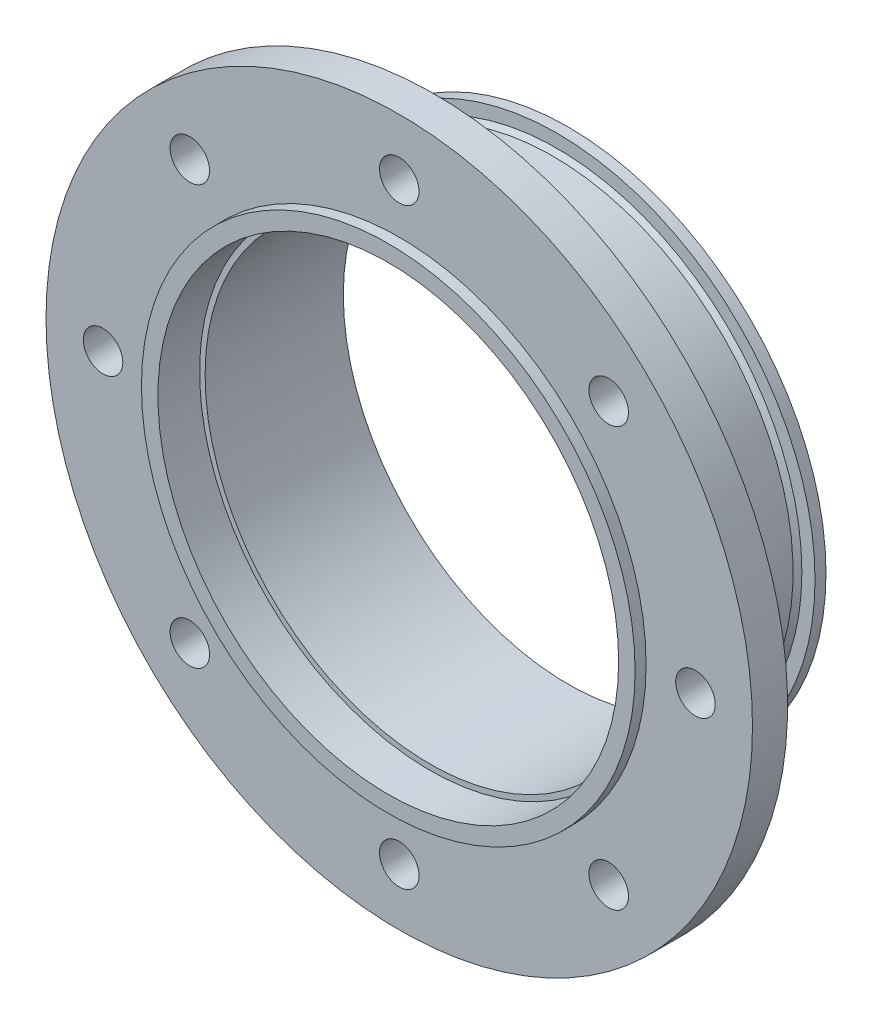
ISO-10303-21;
HEADER;
FILE_DESCRIPTION(('STEP AP214'),'2;1');
FILE_NAME('part.step','',(''),(''),'','','');
FILE_SCHEMA(('AUTOMOTIVE_DESIGN { 1 0 10303 214 1 1 1 1 }'));
ENDSEC;
DATA;
#1=APPLICATION_CONTEXT('core data for automotive mechanical design processes');
#2=APPLICATION_PROTOCOL_DEFINITION('international standard','automotive_design',2000,#1);
#3=PRODUCT_CONTEXT('',#1,'mechanical');
#4=PRODUCT('Part','Part','',(#3));
#5=PRODUCT_RELATED_PRODUCT_CATEGORY('part','',(#4));
#6=PRODUCT_DEFINITION_FORMATION('','',#4);
#7=PRODUCT_DEFINITION_CONTEXT('part definition',#1,'design');
#8=PRODUCT_DEFINITION('design','',#6,#7);
#9=PRODUCT_DEFINITION_SHAPE('','',#8);
#10=(LENGTH_UNIT() NAMED_UNIT(*) SI_UNIT(.MILLI.,.METRE.));
#11=(NAMED_UNIT(*) PLANE_ANGLE_UNIT() SI_UNIT($,.RADIAN.));
#12=(NAMED_UNIT(*) SI_UNIT($,.STERADIAN.) SOLID_ANGLE_UNIT());
#13=UNCERTAINTY_MEASURE_WITH_UNIT(LENGTH_MEASURE(1.E-05),#10,'distance_accuracy_value','');
#14=(GEOMETRIC_REPRESENTATION_CONTEXT(3) GLOBAL_UNCERTAINTY_ASSIGNED_CONTEXT((#13)) GLOBAL_UNIT_ASSIGNED_CONTEXT((#10,
#11,#12)) REPRESENTATION_CONTEXT('',''));
#15=CARTESIAN_POINT('',(0.,0.,0.));
#16=DIRECTION('',(0.,0.,1.));
#17=DIRECTION('',(1.,0.,0.));
#18=AXIS2_PLACEMENT_3D('',#15,#16,#17);
#19=CARTESIAN_POINT('',(0.,0.,82.));
#20=DIRECTION('',(0.,0.,-1.));
#21=DIRECTION('',(-1.,0.,0.));
#22=AXIS2_PLACEMENT_3D('',#19,#20,#21);
#23=CYLINDRICAL_SURFACE('',#22,102.5);
#24=CARTESIAN_POINT('',(0.,0.,0.));
#25=DIRECTION('',(0.,0.,1.));
#26=DIRECTION('',(1.,0.,0.));
#27=AXIS2_PLACEMENT_3D('',#24,#25,#26);
#28=CIRCLE('',#27,102.5);
#29=CARTESIAN_POINT('',(102.5,0.,0.));
#30=VERTEX_POINT('',#29);
#31=EDGE_CURVE('E74',#30,#30,#28,.T.);
#32=ORIENTED_EDGE('',*,*,#31,.F.);
#33=EDGE_LOOP('',(#32));
#34=FACE_BOUND('',#33,.T.);
#35=CARTESIAN_POINT('',(0.,0.,63.));
#36=DIRECTION('',(0.,0.,1.));
#37=DIRECTION('',(1.,0.,0.));
#38=AXIS2_PLACEMENT_3D('',#35,#36,#37);
#39=CIRCLE('',#38,102.5);
#40=CARTESIAN_POINT('',(102.5,0.,63.));
#41=VERTEX_POINT('',#40);
#42=EDGE_CURVE('E54',#41,#41,#39,.T.);
#43=ORIENTED_EDGE('',*,*,#42,.T.);
#44=EDGE_LOOP('',(#43));
#45=FACE_BOUND('',#44,.T.);
#46=ADVANCED_FACE('F49',(#34,#45),#23,.F.);
#47=CARTESIAN_POINT('',(0.,0.,82.));
#48=DIRECTION('',(0.,0.,-1.));
#49=DIRECTION('',(-1.,0.,0.));
#50=AXIS2_PLACEMENT_3D('',#47,#48,#49);
#51=CYLINDRICAL_SURFACE('',#50,161.);
#52=CARTESIAN_POINT('',(0.,0.,61.));
#53=DIRECTION('',(0.,0.,-1.));
#54=DIRECTION('',(-1.,0.,0.));
#55=AXIS2_PLACEMENT_3D('',#52,#53,#54);
#56=CIRCLE('',#55,161.);
#57=CARTESIAN_POINT('',(-161.,0.,61.));
#58=VERTEX_POINT('',#57);
#59=EDGE_CURVE('E86',#58,#58,#56,.T.);
#60=ORIENTED_EDGE('',*,*,#59,.F.);
#61=EDGE_LOOP('',(#60));
#62=FACE_BOUND('',#61,.T.);
#63=CARTESIAN_POINT('',(0.,0.,77.));
#64=DIRECTION('',(0.,0.,1.));
#65=DIRECTION('',(1.,0.,0.));
#66=AXIS2_PLACEMENT_3D('',#63,#64,#65);
#67=CIRCLE('',#66,161.);
#68=CARTESIAN_POINT('',(161.,0.,77.));
#69=VERTEX_POINT('',#68);
#70=EDGE_CURVE('E80',#69,#69,#67,.T.);
#71=ORIENTED_EDGE('',*,*,#70,.F.);
#72=EDGE_LOOP('',(#71));
#73=FACE_BOUND('',#72,.T.);
#74=ADVANCED_FACE('F190',(#62,#73),#51,.T.);
#75=CARTESIAN_POINT('',(0.,135.,0.));
#76=DIRECTION('',(0.,0.,1.));
#77=DIRECTION('',(1.,0.,0.));
#78=AXIS2_PLACEMENT_3D('',#75,#76,#77);
#79=CYLINDRICAL_SURFACE('',#78,9.);
#80=CARTESIAN_POINT('',(0.,135.,61.));
#81=DIRECTION('',(0.,0.,-1.));
#82=DIRECTION('',(-1.,0.,0.));
#83=AXIS2_PLACEMENT_3D('',#80,#81,#82);
#84=CIRCLE('',#83,9.);
#85=CARTESIAN_POINT('',(-9.,135.,61.));
#86=VERTEX_POINT('',#85);
#87=EDGE_CURVE('E90',#86,#86,#84,.F.);
#88=ORIENTED_EDGE('',*,*,#87,.F.);
#89=EDGE_LOOP('',(#88));
#90=FACE_BOUND('',#89,.T.);
#91=CARTESIAN_POINT('',(0.,135.,77.));
#92=DIRECTION('',(0.,0.,1.));
#93=DIRECTION('',(1.,0.,0.));
#94=AXIS2_PLACEMENT_3D('',#91,#92,#93);
#95=CIRCLE('',#94,9.);
#96=CARTESIAN_POINT('',(9.,135.,77.));
#97=VERTEX_POINT('',#96);
#98=EDGE_CURVE('E125',#97,#97,#95,.F.);
#99=ORIENTED_EDGE('',*,*,#98,.F.);
#100=EDGE_LOOP('',(#99));
#101=FACE_BOUND('',#100,.T.);
#102=ADVANCED_FACE('F196',(#90,#101),#79,.F.);
#103=CARTESIAN_POINT('',(-95.4594154601841,95.4594154601838,0.));
#104=DIRECTION('',(0.,0.,1.));
#105=DIRECTION('',(1.,0.,0.));
#106=AXIS2_PLACEMENT_3D('',#103,#104,#105);
#107=CYLINDRICAL_SURFACE('',#106,9.);
#108=CARTESIAN_POINT('',(-95.4594154601841,95.4594154601838,61.));
#109=DIRECTION('',(0.,0.,-1.));
#110=DIRECTION('',(-1.,0.,0.));
#111=AXIS2_PLACEMENT_3D('',#108,#109,#110);
#112=CIRCLE('',#111,9.);
#113=CARTESIAN_POINT('',(-104.459415460184,95.4594154601838,61.));
#114=VERTEX_POINT('',#113);
#115=EDGE_CURVE('E94',#114,#114,#112,.F.);
#116=ORIENTED_EDGE('',*,*,#115,.F.);
#117=EDGE_LOOP('',(#116));
#118=FACE_BOUND('',#117,.T.);
#119=CARTESIAN_POINT('',(-95.4594154601841,95.4594154601838,77.));
#120=DIRECTION('',(0.,0.,1.));
#121=DIRECTION('',(1.,0.,0.));
#122=AXIS2_PLACEMENT_3D('',#119,#120,#121);
#123=CIRCLE('',#122,9.);
#124=CARTESIAN_POINT('',(-86.4594154601841,95.4594154601838,77.));
#125=VERTEX_POINT('',#124);
#126=EDGE_CURVE('E132',#125,#125,#123,.F.);
#127=ORIENTED_EDGE('',*,*,#126,.F.);
#128=EDGE_LOOP('',(#127));
#129=FACE_BOUND('',#128,.T.);
#130=ADVANCED_FACE('F261',(#118,#129),#107,.F.);
#131=CARTESIAN_POINT('',(95.4594154601828,95.4594154601851,0.));
#132=DIRECTION('',(0.,0.,1.));
#133=DIRECTION('',(1.,0.,0.));
#134=AXIS2_PLACEMENT_3D('',#131,#132,#133);
#135=CYLINDRICAL_SURFACE('',#134,9.);
#136=CARTESIAN_POINT('',(95.4594154601828,95.4594154601851,61.));
#137=DIRECTION('',(0.,0.,-1.));
#138=DIRECTION('',(-1.,0.,0.));
#139=AXIS2_PLACEMENT_3D('',#136,#137,#138);
#140=CIRCLE('',#139,9.);
#141=CARTESIAN_POINT('',(86.4594154601828,95.4594154601851,61.));
#142=VERTEX_POINT('',#141);
#143=EDGE_CURVE('E98',#142,#142,#140,.F.);
#144=ORIENTED_EDGE('',*,*,#143,.F.);
#145=EDGE_LOOP('',(#144));
#146=FACE_BOUND('',#145,.T.);
#147=CARTESIAN_POINT('',(95.4594154601828,95.4594154601851,77.));
#148=DIRECTION('',(0.,0.,1.));
#149=DIRECTION('',(1.,0.,0.));
#150=AXIS2_PLACEMENT_3D('',#147,#148,#149);
#151=CIRCLE('',#150,9.);
#152=CARTESIAN_POINT('',(104.459415460183,95.4594154601851,77.));
#153=VERTEX_POINT('',#152);
#154=EDGE_CURVE('E136',#153,#153,#151,.F.);
#155=ORIENTED_EDGE('',*,*,#154,.F.);
#156=EDGE_LOOP('',(#155));
#157=FACE_BOUND('',#156,.T.);
#158=ADVANCED_FACE('F257',(#146,#157),#135,.F.);
#159=CARTESIAN_POINT('',(135.,1.41404994223147E-12,0.));
#160=DIRECTION('',(0.,0.,1.));
#161=DIRECTION('',(1.,0.,0.));
#162=AXIS2_PLACEMENT_3D('',#159,#160,#161);
#163=CYLINDRICAL_SURFACE('',#162,9.);
#164=CARTESIAN_POINT('',(135.,1.41404994223147E-12,61.));
#165=DIRECTION('',(0.,0.,-1.));
#166=DIRECTION('',(-1.,0.,0.));
#167=AXIS2_PLACEMENT_3D('',#164,#165,#166);
#168=CIRCLE('',#167,9.);
#169=CARTESIAN_POINT('',(126.,1.41404994223147E-12,61.));
#170=VERTEX_POINT('',#169);
#171=EDGE_CURVE('E102',#170,#170,#168,.F.);
#172=ORIENTED_EDGE('',*,*,#171,.F.);
#173=EDGE_LOOP('',(#172));
#174=FACE_BOUND('',#173,.T.);
#175=CARTESIAN_POINT('',(135.,1.41404994223147E-12,77.));
#176=DIRECTION('',(0.,0.,1.));
#177=DIRECTION('',(1.,0.,0.));
#178=AXIS2_PLACEMENT_3D('',#175,#176,#177);
#179=CIRCLE('',#178,9.);
#180=CARTESIAN_POINT('',(144.,1.41404994223147E-12,77.));
#181=VERTEX_POINT('',#180);
#182=EDGE_CURVE('E140',#181,#181,#179,.F.);
#183=ORIENTED_EDGE('',*,*,#182,.F.);
#184=EDGE_LOOP('',(#183));
#185=FACE_BOUND('',#184,.T.);
#186=ADVANCED_FACE('F253',(#174,#185),#163,.F.);
#187=CARTESIAN_POINT('',(95.4594154601848,-95.4594154601831,0.));
#188=DIRECTION('',(0.,0.,1.));
#189=DIRECTION('',(1.,0.,0.));
#190=AXIS2_PLACEMENT_3D('',#187,#188,#189);
#191=CYLINDRICAL_SURFACE('',#190,9.);
#192=CARTESIAN_POINT('',(95.4594154601848,-95.4594154601831,61.));
#193=DIRECTION('',(0.,0.,-1.));
#194=DIRECTION('',(-1.,0.,0.));
#195=AXIS2_PLACEMENT_3D('',#192,#193,#194);
#196=CIRCLE('',#195,9.);
#197=CARTESIAN_POINT('',(86.4594154601847,-95.4594154601831,61.));
#198=VERTEX_POINT('',#197);
#199=EDGE_CURVE('E106',#198,#198,#196,.F.);
#200=ORIENTED_EDGE('',*,*,#199,.F.);
#201=EDGE_LOOP('',(#200));
#202=FACE_BOUND('',#201,.T.);
#203=CARTESIAN_POINT('',(95.4594154601848,-95.4594154601831,77.));
#204=DIRECTION('',(0.,0.,1.));
#205=DIRECTION('',(1.,0.,0.));
#206=AXIS2_PLACEMENT_3D('',#203,#204,#205);
#207=CIRCLE('',#206,9.);
#208=CARTESIAN_POINT('',(104.459415460185,-95.4594154601831,77.));
#209=VERTEX_POINT('',#208);
#210=EDGE_CURVE('E144',#209,#209,#207,.F.);
#211=ORIENTED_EDGE('',*,*,#210,.F.);
#212=EDGE_LOOP('',(#211));
#213=FACE_BOUND('',#212,.T.);
#214=ADVANCED_FACE('F256',(#202,#213),#191,.F.);
#215=CARTESIAN_POINT('',(0.,-135.,0.));
#216=DIRECTION('',(0.,0.,1.));
#217=DIRECTION('',(1.,0.,0.));
#218=AXIS2_PLACEMENT_3D('',#215,#216,#217);
#219=CYLINDRICAL_SURFACE('',#218,9.);
#220=CARTESIAN_POINT('',(0.,-135.,61.));
#221=DIRECTION('',(0.,0.,-1.));
#222=DIRECTION('',(-1.,0.,0.));
#223=AXIS2_PLACEMENT_3D('',#220,#221,#222);
#224=CIRCLE('',#223,9.);
#225=CARTESIAN_POINT('',(-9.,-135.,61.));
#226=VERTEX_POINT('',#225);
#227=EDGE_CURVE('E110',#226,#226,#224,.F.);
#228=ORIENTED_EDGE('',*,*,#227,.F.);
#229=EDGE_LOOP('',(#228));
#230=FACE_BOUND('',#229,.T.);
#231=CARTESIAN_POINT('',(0.,-135.,77.));
#232=DIRECTION('',(0.,0.,1.));
#233=DIRECTION('',(1.,0.,0.));
#234=AXIS2_PLACEMENT_3D('',#231,#232,#233);
#235=CIRCLE('',#234,9.);
#236=CARTESIAN_POINT('',(9.,-135.,77.));
#237=VERTEX_POINT('',#236);
#238=EDGE_CURVE('E148',#237,#237,#235,.F.);
#239=ORIENTED_EDGE('',*,*,#238,.F.);
#240=EDGE_LOOP('',(#239));
#241=FACE_BOUND('',#240,.T.);
#242=ADVANCED_FACE('F269',(#230,#241),#219,.F.);
#243=CARTESIAN_POINT('',(-95.4594154601834,-95.4594154601844,0.));
#244=DIRECTION('',(0.,0.,1.));
#245=DIRECTION('',(1.,0.,0.));
#246=AXIS2_PLACEMENT_3D('',#243,#244,#245);
#247=CYLINDRICAL_SURFACE('',#246,9.);
#248=CARTESIAN_POINT('',(-95.4594154601834,-95.4594154601844,61.));
#249=DIRECTION('',(0.,0.,-1.));
#250=DIRECTION('',(-1.,0.,0.));
#251=AXIS2_PLACEMENT_3D('',#248,#249,#250);
#252=CIRCLE('',#251,9.);
#253=CARTESIAN_POINT('',(-104.459415460183,-95.4594154601844,61.));
#254=VERTEX_POINT('',#253);
#255=EDGE_CURVE('E85',#254,#254,#252,.F.);
#256=ORIENTED_EDGE('',*,*,#255,.F.);
#257=EDGE_LOOP('',(#256));
#258=FACE_BOUND('',#257,.T.);
#259=CARTESIAN_POINT('',(-95.4594154601834,-95.4594154601844,77.));
#260=DIRECTION('',(0.,0.,1.));
#261=DIRECTION('',(1.,0.,0.));
#262=AXIS2_PLACEMENT_3D('',#259,#260,#261);
#263=CIRCLE('',#262,9.);
#264=CARTESIAN_POINT('',(-86.4594154601834,-95.4594154601844,77.));
#265=VERTEX_POINT('',#264);
#266=EDGE_CURVE('E79',#265,#265,#263,.F.);
#267=ORIENTED_EDGE('',*,*,#266,.F.);
#268=EDGE_LOOP('',(#267));
#269=FACE_BOUND('',#268,.T.);
#270=ADVANCED_FACE('F265',(#258,#269),#247,.F.);
#271=CARTESIAN_POINT('',(-135.,-4.71349980743823E-13,0.));
#272=DIRECTION('',(0.,0.,1.));
#273=DIRECTION('',(1.,0.,0.));
#274=AXIS2_PLACEMENT_3D('',#271,#272,#273);
#275=CYLINDRICAL_SURFACE('',#274,9.);
#276=CARTESIAN_POINT('',(-135.,-4.71349980743823E-13,61.));
#277=DIRECTION('',(0.,0.,-1.));
#278=DIRECTION('',(-1.,0.,0.));
#279=AXIS2_PLACEMENT_3D('',#276,#277,#278);
#280=CIRCLE('',#279,9.);
#281=CARTESIAN_POINT('',(-144.,-4.71349980743823E-13,61.));
#282=VERTEX_POINT('',#281);
#283=EDGE_CURVE('E81',#282,#282,#280,.F.);
#284=ORIENTED_EDGE('',*,*,#283,.F.);
#285=EDGE_LOOP('',(#284));
#286=FACE_BOUND('',#285,.T.);
#287=CARTESIAN_POINT('',(-135.,-4.71349980743823E-13,77.));
#288=DIRECTION('',(0.,0.,1.));
#289=DIRECTION('',(1.,0.,0.));
#290=AXIS2_PLACEMENT_3D('',#287,#288,#289);
#291=CIRCLE('',#290,9.);
#292=CARTESIAN_POINT('',(-126.,-4.71349980743823E-13,77.));
#293=VERTEX_POINT('',#292);
#294=EDGE_CURVE('E75',#293,#293,#291,.F.);
#295=ORIENTED_EDGE('',*,*,#294,.F.);
#296=EDGE_LOOP('',(#295));
#297=FACE_BOUND('',#296,.T.);
#298=ADVANCED_FACE('F207',(#286,#297),#275,.F.);
#299=CARTESIAN_POINT('',(0.,0.,82.));
#300=DIRECTION('',(0.,0.,1.));
#301=DIRECTION('',(1.,0.,0.));
#302=AXIS2_PLACEMENT_3D('',#299,#300,#301);
#303=PLANE('',#302);
#304=CARTESIAN_POINT('',(0.,0.,82.));
#305=DIRECTION('',(0.,0.,1.));
#306=DIRECTION('',(1.,0.,0.));
#307=AXIS2_PLACEMENT_3D('',#304,#305,#306);
#308=CIRCLE('',#307,105.);
#309=CARTESIAN_POINT('',(105.,0.,82.));
#310=VERTEX_POINT('',#309);
#311=EDGE_CURVE('E166',#310,#310,#308,.T.);
#312=ORIENTED_EDGE('',*,*,#311,.F.);
#313=EDGE_LOOP('',(#312));
#314=FACE_BOUND('',#313,.T.);
#315=CARTESIAN_POINT('',(0.,0.,82.));
#316=DIRECTION('',(0.,0.,1.));
#317=DIRECTION('',(1.,0.,0.));
#318=AXIS2_PLACEMENT_3D('',#315,#316,#317);
#319=CIRCLE('',#318,112.5);
#320=CARTESIAN_POINT('',(112.5,0.,82.));
#321=VERTEX_POINT('',#320);
#322=EDGE_CURVE('E159',#321,#321,#319,.T.);
#323=ORIENTED_EDGE('',*,*,#322,.T.);
#324=EDGE_LOOP('',(#323));
#325=FACE_BOUND('',#324,.T.);
#326=ADVANCED_FACE('F203',(#314,#325),#303,.T.);
#327=CARTESIAN_POINT('',(0.,0.,61.));
#328=DIRECTION('',(0.,0.,-1.));
#329=DIRECTION('',(-1.,0.,0.));
#330=AXIS2_PLACEMENT_3D('',#327,#328,#329);
#331=CYLINDRICAL_SURFACE('',#330,109.5);
#332=CARTESIAN_POINT('',(0.,0.,58.9999999999997));
#333=DIRECTION('',(0.,0.,-1.));
#334=DIRECTION('',(-1.,0.,0.));
#335=AXIS2_PLACEMENT_3D('',#332,#333,#334);
#336=CIRCLE('',#335,109.5);
#337=CARTESIAN_POINT('',(-109.5,0.,58.9999999999997));
#338=VERTEX_POINT('',#337);
#339=EDGE_CURVE('E59',#338,#338,#336,.T.);
#340=CARTESIAN_POINT('',(0.,0.,6.99999999999978));
#341=DIRECTION('',(0.,0.,-1.));
#342=DIRECTION('',(-1.,0.,0.));
#343=AXIS2_PLACEMENT_3D('',#340,#341,#342);
#344=CIRCLE('',#343,109.5);
#345=CARTESIAN_POINT('',(-109.5,0.,6.99999999999978));
#346=VERTEX_POINT('',#345);
#347=EDGE_CURVE('E64',#346,#346,#344,.F.);
#348=CARTESIAN_POINT('',(-109.5,0.,58.9999999999997));
#349=CARTESIAN_POINT('',(-109.5,0.,58.4583333333331));
#350=CARTESIAN_POINT('',(-109.5,0.,57.9166666666664));
#351=CARTESIAN_POINT('',(-109.5,0.,56.8333333333331));
#352=CARTESIAN_POINT('',(-109.5,0.,56.2916666666664));
#353=CARTESIAN_POINT('',(-109.5,0.,55.2083333333331));
#354=CARTESIAN_POINT('',(-109.5,0.,54.6666666666664));
#355=CARTESIAN_POINT('',(-109.5,0.,53.5833333333331));
#356=CARTESIAN_POINT('',(-109.5,0.,53.0416666666664));
#357=CARTESIAN_POINT('',(-109.5,0.,51.9583333333331));
#358=CARTESIAN_POINT('',(-109.5,0.,51.4166666666664));
#359=CARTESIAN_POINT('',(-109.5,0.,50.3333333333331));
#360=CARTESIAN_POINT('',(-109.5,0.,49.7916666666664));
#361=CARTESIAN_POINT('',(-109.5,0.,48.7083333333331));
#362=CARTESIAN_POINT('',(-109.5,0.,48.1666666666664));
#363=CARTESIAN_POINT('',(-109.5,0.,47.0833333333331));
#364=CARTESIAN_POINT('',(-109.5,0.,46.5416666666664));
#365=CARTESIAN_POINT('',(-109.5,0.,45.4583333333331));
#366=CARTESIAN_POINT('',(-109.5,0.,44.9166666666664));
#367=CARTESIAN_POINT('',(-109.5,0.,43.8333333333331));
#368=CARTESIAN_POINT('',(-109.5,0.,43.2916666666664));
#369=CARTESIAN_POINT('',(-109.5,0.,42.2083333333331));
#370=CARTESIAN_POINT('',(-109.5,0.,41.6666666666664));
#371=CARTESIAN_POINT('',(-109.5,0.,40.5833333333331));
#372=CARTESIAN_POINT('',(-109.5,0.,40.0416666666664));
#373=CARTESIAN_POINT('',(-109.5,0.,38.9583333333331));
#374=CARTESIAN_POINT('',(-109.5,0.,38.4166666666664));
#375=CARTESIAN_POINT('',(-109.5,0.,37.3333333333331));
#376=CARTESIAN_POINT('',(-109.5,0.,36.7916666666664));
#377=CARTESIAN_POINT('',(-109.5,0.,35.7083333333331));
#378=CARTESIAN_POINT('',(-109.5,0.,35.1666666666664));
#379=CARTESIAN_POINT('',(-109.5,0.,34.0833333333331));
#380=CARTESIAN_POINT('',(-109.5,0.,33.5416666666664));
#381=CARTESIAN_POINT('',(-109.5,0.,32.4583333333331));
#382=CARTESIAN_POINT('',(-109.5,0.,31.9166666666664));
#383=CARTESIAN_POINT('',(-109.5,0.,30.8333333333331));
#384=CARTESIAN_POINT('',(-109.5,0.,30.2916666666664));
#385=CARTESIAN_POINT('',(-109.5,0.,29.2083333333331));
#386=CARTESIAN_POINT('',(-109.5,0.,28.6666666666664));
#387=CARTESIAN_POINT('',(-109.5,0.,27.5833333333331));
#388=CARTESIAN_POINT('',(-109.5,0.,27.0416666666664));
#389=CARTESIAN_POINT('',(-109.5,0.,25.9583333333331));
#390=CARTESIAN_POINT('',(-109.5,0.,25.4166666666664));
#391=CARTESIAN_POINT('',(-109.5,0.,24.3333333333331));
#392=CARTESIAN_POINT('',(-109.5,0.,23.7916666666664));
#393=CARTESIAN_POINT('',(-109.5,0.,22.7083333333331));
#394=CARTESIAN_POINT('',(-109.5,0.,22.1666666666664));
#395=CARTESIAN_POINT('',(-109.5,0.,21.0833333333331));
#396=CARTESIAN_POINT('',(-109.5,0.,20.5416666666664));
#397=CARTESIAN_POINT('',(-109.5,0.,19.4583333333331));
#398=CARTESIAN_POINT('',(-109.5,0.,18.9166666666664));
#399=CARTESIAN_POINT('',(-109.5,0.,17.8333333333331));
#400=CARTESIAN_POINT('',(-109.5,0.,17.2916666666664));
#401=CARTESIAN_POINT('',(-109.5,0.,16.2083333333331));
#402=CARTESIAN_POINT('',(-109.5,0.,15.6666666666664));
#403=CARTESIAN_POINT('',(-109.5,0.,14.5833333333331));
#404=CARTESIAN_POINT('',(-109.5,0.,14.0416666666664));
#405=CARTESIAN_POINT('',(-109.5,0.,12.9583333333331));
#406=CARTESIAN_POINT('',(-109.5,0.,12.4166666666664));
#407=CARTESIAN_POINT('',(-109.5,0.,11.3333333333331));
#408=CARTESIAN_POINT('',(-109.5,0.,10.7916666666664));
#409=CARTESIAN_POINT('',(-109.5,0.,9.70833333333311));
#410=CARTESIAN_POINT('',(-109.5,0.,9.16666666666645));
#411=CARTESIAN_POINT('',(-109.5,0.,8.08333333333311));
#412=CARTESIAN_POINT('',(-109.5,0.,7.54166666666644));
#413=CARTESIAN_POINT('',(-109.5,0.,6.99999999999978));
#414=B_SPLINE_CURVE_WITH_KNOTS('',3,(#348,#349,#350,#351,#352,#353,#354,#355,#356,#357,#358,
#359,#360,#361,#362,#363,#364,#365,#366,#367,#368,#369,#370,#371,#372,#373,#374,#375,#376,#377,
#378,#379,#380,#381,#382,#383,#384,#385,#386,#387,#388,#389,#390,#391,#392,#393,#394,#395,#396,
#397,#398,#399,#400,#401,#402,#403,#404,#405,#406,#407,#408,#409,#410,#411,#412,#413),
.UNSPECIFIED.,.F.,.F.,(4,2,2,2,2,2,2,2,2,2,2,2,2,2,2,2,2,2,2,2,2,2,2,2,2,2,2,2,2,2,2,2,4),(0.,
1.625,3.25,4.875,6.5,8.12499999999999,9.74999999999999,11.375,13.,14.625,16.25,17.875,19.5,
21.125,22.75,24.375,26.,27.625,29.25,30.875,32.5,34.125,35.75,37.375,39.,40.625,42.25,43.875,
45.5,47.1249999999999,48.7499999999999,50.375,52.),.UNSPECIFIED.);
#415=EDGE_CURVE('BSEAM206',#338,#346,#414,.T.);
#416=ORIENTED_EDGE('',*,*,#339,.T.);
#417=ORIENTED_EDGE('',*,*,#347,.T.);
#418=ORIENTED_EDGE('',*,*,#415,.T.);
#419=ORIENTED_EDGE('',*,*,#415,.F.);
#420=EDGE_LOOP('',(#416,#418,#417,#419));
#421=FACE_BOUND('',#420,.T.);
#422=ADVANCED_FACE('F206',(#421),#331,.T.);
#423=CARTESIAN_POINT('',(0.,0.,0.));
#424=DIRECTION('',(0.,0.,1.));
#425=DIRECTION('',(1.,0.,0.));
#426=AXIS2_PLACEMENT_3D('',#423,#424,#425);
#427=PLANE('',#426);
#428=ORIENTED_EDGE('',*,*,#31,.T.);
#429=EDGE_LOOP('',(#428));
#430=FACE_BOUND('',#429,.T.);
#431=CARTESIAN_POINT('',(0.,0.,0.));
#432=DIRECTION('',(0.,0.,-1.));
#433=DIRECTION('',(-1.,0.,0.));
#434=AXIS2_PLACEMENT_3D('',#431,#432,#433);
#435=CIRCLE('',#434,117.5);
#436=CARTESIAN_POINT('',(-117.5,0.,0.));
#437=VERTEX_POINT('',#436);
#438=EDGE_CURVE('E121',#437,#437,#435,.T.);
#439=ORIENTED_EDGE('',*,*,#438,.T.);
#440=EDGE_LOOP('',(#439));
#441=FACE_BOUND('',#440,.T.);
#442=ADVANCED_FACE('F209',(#430,#441),#427,.F.);
#443=CARTESIAN_POINT('',(0.,0.,61.));
#444=DIRECTION('',(0.,0.,-1.));
#445=DIRECTION('',(-1.,0.,0.));
#446=AXIS2_PLACEMENT_3D('',#443,#444,#445);
#447=PLANE('',#446);
#448=CARTESIAN_POINT('',(0.,0.,61.));
#449=DIRECTION('',(0.,0.,-1.));
#450=DIRECTION('',(-1.,0.,0.));
#451=AXIS2_PLACEMENT_3D('',#448,#449,#450);
#452=CIRCLE('',#451,111.5);
#453=CARTESIAN_POINT('',(-111.5,0.,61.));
#454=VERTEX_POINT('',#453);
#455=EDGE_CURVE('E11',#454,#454,#452,.F.);
#456=ORIENTED_EDGE('',*,*,#455,.T.);
#457=EDGE_LOOP('',(#456));
#458=FACE_BOUND('',#457,.T.);
#459=ORIENTED_EDGE('',*,*,#59,.T.);
#460=EDGE_LOOP('',(#459));
#461=FACE_BOUND('',#460,.T.);
#462=ORIENTED_EDGE('',*,*,#283,.T.);
#463=EDGE_LOOP('',(#462));
#464=FACE_BOUND('',#463,.T.);
#465=ORIENTED_EDGE('',*,*,#255,.T.);
#466=EDGE_LOOP('',(#465));
#467=FACE_BOUND('',#466,.T.);
#468=ORIENTED_EDGE('',*,*,#227,.T.);
#469=EDGE_LOOP('',(#468));
#470=FACE_BOUND('',#469,.T.);
#471=ORIENTED_EDGE('',*,*,#199,.T.);
#472=EDGE_LOOP('',(#471));
#473=FACE_BOUND('',#472,.T.);
#474=ORIENTED_EDGE('',*,*,#171,.T.);
#475=EDGE_LOOP('',(#474));
#476=FACE_BOUND('',#475,.T.);
#477=ORIENTED_EDGE('',*,*,#143,.T.);
#478=EDGE_LOOP('',(#477));
#479=FACE_BOUND('',#478,.T.);
#480=ORIENTED_EDGE('',*,*,#115,.T.);
#481=EDGE_LOOP('',(#480));
#482=FACE_BOUND('',#481,.T.);
#483=ORIENTED_EDGE('',*,*,#87,.T.);
#484=EDGE_LOOP('',(#483));
#485=FACE_BOUND('',#484,.T.);
#486=ADVANCED_FACE('F211',(#458,#461,#464,#467,#470,#473,#476,#479,#482,#485),#447,.T.);
#487=CARTESIAN_POINT('',(0.,0.,5.));
#488=DIRECTION('',(0.,0.,-1.));
#489=DIRECTION('',(-1.,0.,0.));
#490=AXIS2_PLACEMENT_3D('',#487,#488,#489);
#491=CYLINDRICAL_SURFACE('',#490,117.5);
#492=CARTESIAN_POINT('',(0.,0.,5.));
#493=DIRECTION('',(0.,0.,-1.));
#494=DIRECTION('',(-1.,0.,0.));
#495=AXIS2_PLACEMENT_3D('',#492,#493,#494);
#496=CIRCLE('',#495,117.5);
#497=CARTESIAN_POINT('',(-117.5,0.,5.));
#498=VERTEX_POINT('',#497);
#499=EDGE_CURVE('E120',#498,#498,#496,.T.);
#500=ORIENTED_EDGE('',*,*,#499,.T.);
#501=EDGE_LOOP('',(#500));
#502=FACE_BOUND('',#501,.T.);
#503=ORIENTED_EDGE('',*,*,#438,.F.);
#504=EDGE_LOOP('',(#503));
#505=FACE_BOUND('',#504,.T.);
#506=ADVANCED_FACE('F235',(#502,#505),#491,.T.);
#507=CARTESIAN_POINT('',(0.,0.,5.));
#508=DIRECTION('',(0.,0.,-1.));
#509=DIRECTION('',(-1.,0.,0.));
#510=AXIS2_PLACEMENT_3D('',#507,#508,#509);
#511=PLANE('',#510);
#512=CARTESIAN_POINT('',(0.,0.,5.));
#513=DIRECTION('',(0.,0.,-1.));
#514=DIRECTION('',(-1.,0.,0.));
#515=AXIS2_PLACEMENT_3D('',#512,#513,#514);
#516=CIRCLE('',#515,111.5);
#517=CARTESIAN_POINT('',(-111.5,0.,5.));
#518=VERTEX_POINT('',#517);
#519=EDGE_CURVE('E70',#518,#518,#516,.T.);
#520=ORIENTED_EDGE('',*,*,#519,.T.);
#521=EDGE_LOOP('',(#520));
#522=FACE_BOUND('',#521,.T.);
#523=ORIENTED_EDGE('',*,*,#499,.F.);
#524=EDGE_LOOP('',(#523));
#525=FACE_BOUND('',#524,.T.);
#526=ADVANCED_FACE('F232',(#522,#525),#511,.F.);
#527=CARTESIAN_POINT('',(0.,0.,77.));
#528=DIRECTION('',(0.,0.,1.));
#529=DIRECTION('',(1.,0.,0.));
#530=AXIS2_PLACEMENT_3D('',#527,#528,#529);
#531=PLANE('',#530);
#532=CARTESIAN_POINT('',(0.,0.,77.));
#533=DIRECTION('',(0.,0.,1.));
#534=DIRECTION('',(1.,0.,0.));
#535=AXIS2_PLACEMENT_3D('',#532,#533,#534);
#536=CIRCLE('',#535,112.5);
#537=CARTESIAN_POINT('',(112.5,0.,77.));
#538=VERTEX_POINT('',#537);
#539=EDGE_CURVE('E158',#538,#538,#536,.T.);
#540=ORIENTED_EDGE('',*,*,#539,.F.);
#541=EDGE_LOOP('',(#540));
#542=FACE_BOUND('',#541,.T.);
#543=ORIENTED_EDGE('',*,*,#70,.T.);
#544=EDGE_LOOP('',(#543));
#545=FACE_BOUND('',#544,.T.);
#546=ORIENTED_EDGE('',*,*,#294,.T.);
#547=EDGE_LOOP('',(#546));
#548=FACE_BOUND('',#547,.T.);
#549=ORIENTED_EDGE('',*,*,#266,.T.);
#550=EDGE_LOOP('',(#549));
#551=FACE_BOUND('',#550,.T.);
#552=ORIENTED_EDGE('',*,*,#238,.T.);
#553=EDGE_LOOP('',(#552));
#554=FACE_BOUND('',#553,.T.);
#555=ORIENTED_EDGE('',*,*,#210,.T.);
#556=EDGE_LOOP('',(#555));
#557=FACE_BOUND('',#556,.T.);
#558=ORIENTED_EDGE('',*,*,#182,.T.);
#559=EDGE_LOOP('',(#558));
#560=FACE_BOUND('',#559,.T.);
#561=ORIENTED_EDGE('',*,*,#154,.T.);
#562=EDGE_LOOP('',(#561));
#563=FACE_BOUND('',#562,.T.);
#564=ORIENTED_EDGE('',*,*,#126,.T.);
#565=EDGE_LOOP('',(#564));
#566=FACE_BOUND('',#565,.T.);
#567=ORIENTED_EDGE('',*,*,#98,.T.);
#568=EDGE_LOOP('',(#567));
#569=FACE_BOUND('',#568,.T.);
#570=ADVANCED_FACE('F225',(#542,#545,#548,#551,#554,#557,#560,#563,#566,#569),#531,.T.);
#571=CARTESIAN_POINT('',(0.,0.,77.));
#572=DIRECTION('',(0.,0.,1.));
#573=DIRECTION('',(1.,0.,0.));
#574=AXIS2_PLACEMENT_3D('',#571,#572,#573);
#575=CYLINDRICAL_SURFACE('',#574,112.5);
#576=ORIENTED_EDGE('',*,*,#539,.T.);
#577=EDGE_LOOP('',(#576));
#578=FACE_BOUND('',#577,.T.);
#579=ORIENTED_EDGE('',*,*,#322,.F.);
#580=EDGE_LOOP('',(#579));
#581=FACE_BOUND('',#580,.T.);
#582=ADVANCED_FACE('F218',(#578,#581),#575,.T.);
#583=CARTESIAN_POINT('',(0.,0.,5.));
#584=DIRECTION('',(0.,0.,-1.));
#585=DIRECTION('',(-1.,0.,0.));
#586=AXIS2_PLACEMENT_3D('',#583,#584,#585);
#587=CONICAL_SURFACE('',#586,111.5,0.785398163397459);
#588=ORIENTED_EDGE('',*,*,#347,.F.);
#589=EDGE_LOOP('',(#588));
#590=FACE_BOUND('',#589,.T.);
#591=ORIENTED_EDGE('',*,*,#519,.F.);
#592=EDGE_LOOP('',(#591));
#593=FACE_BOUND('',#592,.T.);
#594=ADVANCED_FACE('F214',(#590,#593),#587,.T.);
#595=CARTESIAN_POINT('',(0.,0.,58.9999999999997));
#596=DIRECTION('',(0.,0.,1.));
#597=DIRECTION('',(1.,0.,0.));
#598=AXIS2_PLACEMENT_3D('',#595,#596,#597);
#599=CONICAL_SURFACE('',#598,109.5,0.785398163397441);
#600=ORIENTED_EDGE('',*,*,#455,.F.);
#601=EDGE_LOOP('',(#600));
#602=FACE_BOUND('',#601,.T.);
#603=ORIENTED_EDGE('',*,*,#339,.F.);
#604=EDGE_LOOP('',(#603));
#605=FACE_BOUND('',#604,.T.);
#606=ADVANCED_FACE('F52',(#602,#605),#599,.T.);
#607=CARTESIAN_POINT('',(0.,0.,63.));
#608=DIRECTION('',(0.,0.,1.));
#609=DIRECTION('',(1.,0.,0.));
#610=AXIS2_PLACEMENT_3D('',#607,#608,#609);
#611=CYLINDRICAL_SURFACE('',#610,105.);
#612=CARTESIAN_POINT('',(0.,0.,63.));
#613=DIRECTION('',(0.,0.,1.));
#614=DIRECTION('',(1.,0.,0.));
#615=AXIS2_PLACEMENT_3D('',#612,#613,#614);
#616=CIRCLE('',#615,105.);
#617=CARTESIAN_POINT('',(105.,0.,63.));
#618=VERTEX_POINT('',#617);
#619=EDGE_CURVE('E170',#618,#618,#616,.T.);
#620=ORIENTED_EDGE('',*,*,#619,.F.);
#621=EDGE_LOOP('',(#620));
#622=FACE_BOUND('',#621,.T.);
#623=ORIENTED_EDGE('',*,*,#311,.T.);
#624=EDGE_LOOP('',(#623));
#625=FACE_BOUND('',#624,.T.);
#626=ADVANCED_FACE('F182',(#622,#625),#611,.F.);
#627=CARTESIAN_POINT('',(0.,0.,63.));
#628=DIRECTION('',(0.,0.,1.));
#629=DIRECTION('',(1.,0.,0.));
#630=AXIS2_PLACEMENT_3D('',#627,#628,#629);
#631=PLANE('',#630);
#632=ORIENTED_EDGE('',*,*,#42,.F.);
#633=EDGE_LOOP('',(#632));
#634=FACE_BOUND('',#633,.T.);
#635=ORIENTED_EDGE('',*,*,#619,.T.);
#636=EDGE_LOOP('',(#635));
#637=FACE_BOUND('',#636,.T.);
#638=ADVANCED_FACE('F180',(#634,#637),#631,.T.);
#639=CLOSED_SHELL('',(#46,#74,#102,#130,#158,#186,#214,#242,#270,#298,#326,#422,#442,#486,#506,
#526,#570,#582,#594,#606,#626,#638));
#640=MANIFOLD_SOLID_BREP('B2',#639);
#641=ADVANCED_BREP_SHAPE_REPRESENTATION('',(#18,#640),#14);
#642=SHAPE_DEFINITION_REPRESENTATION(#9,#641);
ENDSEC;
END-ISO-10303-21;
